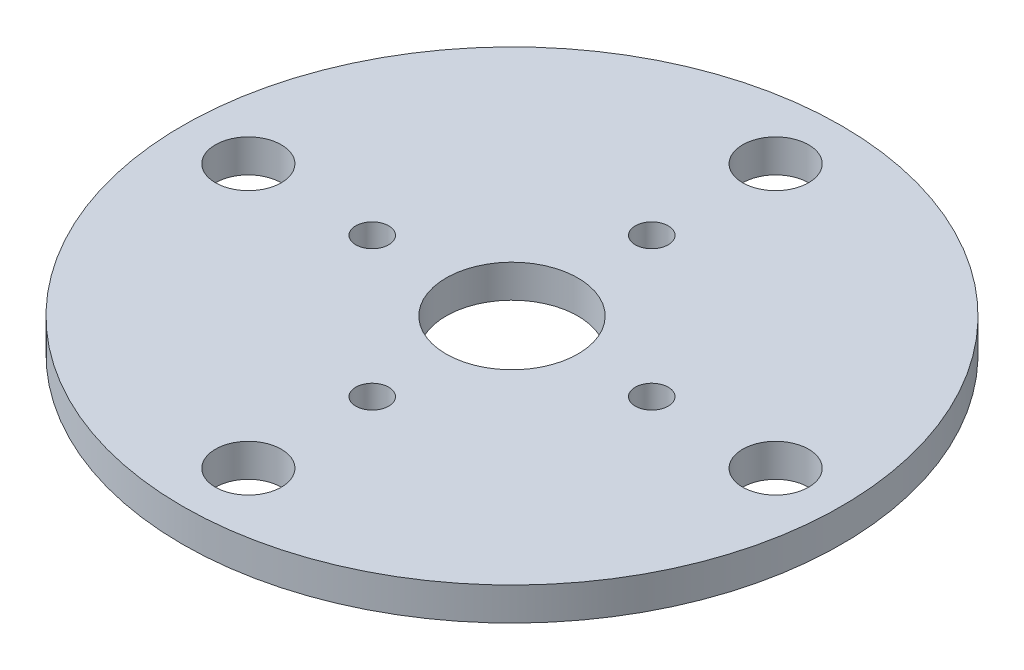
ISO-10303-21;
HEADER;
FILE_DESCRIPTION(('STEP AP214'),'2;1');
FILE_NAME('part.step','',(''),(''),'','','');
FILE_SCHEMA(('AUTOMOTIVE_DESIGN { 1 0 10303 214 1 1 1 1 }'));
ENDSEC;
DATA;
#1=APPLICATION_CONTEXT('core data for automotive mechanical design processes');
#2=APPLICATION_PROTOCOL_DEFINITION('international standard','automotive_design',2000,#1);
#3=PRODUCT_CONTEXT('',#1,'mechanical');
#4=PRODUCT('Part','Part','',(#3));
#5=PRODUCT_RELATED_PRODUCT_CATEGORY('part','',(#4));
#6=PRODUCT_DEFINITION_FORMATION('','',#4);
#7=PRODUCT_DEFINITION_CONTEXT('part definition',#1,'design');
#8=PRODUCT_DEFINITION('design','',#6,#7);
#9=PRODUCT_DEFINITION_SHAPE('','',#8);
#10=(LENGTH_UNIT() NAMED_UNIT(*) SI_UNIT(.MILLI.,.METRE.));
#11=(NAMED_UNIT(*) PLANE_ANGLE_UNIT() SI_UNIT($,.RADIAN.));
#12=(NAMED_UNIT(*) SI_UNIT($,.STERADIAN.) SOLID_ANGLE_UNIT());
#13=UNCERTAINTY_MEASURE_WITH_UNIT(LENGTH_MEASURE(1.E-05),#10,'distance_accuracy_value','');
#14=(GEOMETRIC_REPRESENTATION_CONTEXT(3) GLOBAL_UNCERTAINTY_ASSIGNED_CONTEXT((#13)) GLOBAL_UNIT_ASSIGNED_CONTEXT((#10,
#11,#12)) REPRESENTATION_CONTEXT('',''));
#15=CARTESIAN_POINT('',(0.,0.,0.));
#16=DIRECTION('',(0.,0.,1.));
#17=DIRECTION('',(1.,0.,0.));
#18=AXIS2_PLACEMENT_3D('',#15,#16,#17);
#19=CARTESIAN_POINT('',(0.,1.,0.));
#20=DIRECTION('',(0.,1.,0.));
#21=DIRECTION('',(0.,0.,1.));
#22=AXIS2_PLACEMENT_3D('',#19,#20,#21);
#23=PLANE('',#22);
#24=CARTESIAN_POINT('',(0.,1.,-4.24100258895612));
#25=DIRECTION('',(0.,1.,0.));
#26=DIRECTION('',(0.,0.,1.));
#27=AXIS2_PLACEMENT_3D('',#24,#25,#26);
#28=CIRCLE('',#27,0.499999999999999);
#29=CARTESIAN_POINT('',(0.,1.,-3.74100258895613));
#30=VERTEX_POINT('',#29);
#31=EDGE_CURVE('E83',#30,#30,#28,.T.);
#32=ORIENTED_EDGE('',*,*,#31,.F.);
#33=EDGE_LOOP('',(#32));
#34=FACE_BOUND('',#33,.T.);
#35=CARTESIAN_POINT('',(4.24100258895612,1.,0.));
#36=DIRECTION('',(0.,1.,0.));
#37=DIRECTION('',(0.,0.,-1.));
#38=AXIS2_PLACEMENT_3D('',#35,#36,#37);
#39=CIRCLE('',#38,0.5);
#40=CARTESIAN_POINT('',(4.24100258895612,1.,-0.5));
#41=VERTEX_POINT('',#40);
#42=EDGE_CURVE('E71',#41,#41,#39,.T.);
#43=ORIENTED_EDGE('',*,*,#42,.F.);
#44=EDGE_LOOP('',(#43));
#45=FACE_BOUND('',#44,.T.);
#46=CARTESIAN_POINT('',(0.,1.,4.24100258895612));
#47=DIRECTION('',(0.,1.,0.));
#48=DIRECTION('',(0.,0.,-1.));
#49=AXIS2_PLACEMENT_3D('',#46,#47,#48);
#50=CIRCLE('',#49,0.5);
#51=CARTESIAN_POINT('',(0.,1.,3.74100258895612));
#52=VERTEX_POINT('',#51);
#53=EDGE_CURVE('E59',#52,#52,#50,.T.);
#54=ORIENTED_EDGE('',*,*,#53,.F.);
#55=EDGE_LOOP('',(#54));
#56=FACE_BOUND('',#55,.T.);
#57=CARTESIAN_POINT('',(-8.,1.,0.));
#58=DIRECTION('',(0.,1.,0.));
#59=DIRECTION('',(0.,0.,1.));
#60=AXIS2_PLACEMENT_3D('',#57,#58,#59);
#61=CIRCLE('',#60,1.);
#62=CARTESIAN_POINT('',(-8.,1.,1.));
#63=VERTEX_POINT('',#62);
#64=EDGE_CURVE('E47',#63,#63,#61,.T.);
#65=ORIENTED_EDGE('',*,*,#64,.F.);
#66=EDGE_LOOP('',(#65));
#67=FACE_BOUND('',#66,.T.);
#68=CARTESIAN_POINT('',(0.,1.,0.));
#69=DIRECTION('',(0.,1.,0.));
#70=DIRECTION('',(0.,0.,1.));
#71=AXIS2_PLACEMENT_3D('',#68,#69,#70);
#72=CIRCLE('',#71,10.);
#73=CARTESIAN_POINT('',(0.,1.,10.));
#74=VERTEX_POINT('',#73);
#75=EDGE_CURVE('E10',#74,#74,#72,.T.);
#76=ORIENTED_EDGE('',*,*,#75,.T.);
#77=EDGE_LOOP('',(#76));
#78=FACE_BOUND('',#77,.T.);
#79=CARTESIAN_POINT('',(0.,1.,0.));
#80=DIRECTION('',(0.,1.,0.));
#81=DIRECTION('',(0.,0.,1.));
#82=AXIS2_PLACEMENT_3D('',#79,#80,#81);
#83=CIRCLE('',#82,2.);
#84=CARTESIAN_POINT('',(0.,1.,2.));
#85=VERTEX_POINT('',#84);
#86=EDGE_CURVE('E42',#85,#85,#83,.T.);
#87=ORIENTED_EDGE('',*,*,#86,.F.);
#88=EDGE_LOOP('',(#87));
#89=FACE_BOUND('',#88,.T.);
#90=CARTESIAN_POINT('',(-4.24100258895612,1.,0.));
#91=DIRECTION('',(0.,1.,0.));
#92=DIRECTION('',(0.,0.,1.));
#93=AXIS2_PLACEMENT_3D('',#90,#91,#92);
#94=CIRCLE('',#93,0.5);
#95=CARTESIAN_POINT('',(-4.24100258895612,1.,0.5));
#96=VERTEX_POINT('',#95);
#97=EDGE_CURVE('E53',#96,#96,#94,.T.);
#98=ORIENTED_EDGE('',*,*,#97,.F.);
#99=EDGE_LOOP('',(#98));
#100=FACE_BOUND('',#99,.T.);
#101=CARTESIAN_POINT('',(0.,1.,8.));
#102=DIRECTION('',(0.,1.,0.));
#103=DIRECTION('',(0.,0.,-1.));
#104=AXIS2_PLACEMENT_3D('',#101,#102,#103);
#105=CIRCLE('',#104,1.);
#106=CARTESIAN_POINT('',(0.,1.,7.));
#107=VERTEX_POINT('',#106);
#108=EDGE_CURVE('E65',#107,#107,#105,.T.);
#109=ORIENTED_EDGE('',*,*,#108,.F.);
#110=EDGE_LOOP('',(#109));
#111=FACE_BOUND('',#110,.T.);
#112=CARTESIAN_POINT('',(8.,1.,0.));
#113=DIRECTION('',(0.,1.,0.));
#114=DIRECTION('',(0.,0.,-1.));
#115=AXIS2_PLACEMENT_3D('',#112,#113,#114);
#116=CIRCLE('',#115,1.);
#117=CARTESIAN_POINT('',(8.,1.,-1.));
#118=VERTEX_POINT('',#117);
#119=EDGE_CURVE('E77',#118,#118,#116,.T.);
#120=ORIENTED_EDGE('',*,*,#119,.F.);
#121=EDGE_LOOP('',(#120));
#122=FACE_BOUND('',#121,.T.);
#123=CARTESIAN_POINT('',(0.,1.,-8.));
#124=DIRECTION('',(0.,1.,0.));
#125=DIRECTION('',(0.,0.,1.));
#126=AXIS2_PLACEMENT_3D('',#123,#124,#125);
#127=CIRCLE('',#126,1.);
#128=CARTESIAN_POINT('',(0.,1.,-7.));
#129=VERTEX_POINT('',#128);
#130=EDGE_CURVE('E89',#129,#129,#127,.T.);
#131=ORIENTED_EDGE('',*,*,#130,.F.);
#132=EDGE_LOOP('',(#131));
#133=FACE_BOUND('',#132,.T.);
#134=ADVANCED_FACE('F31',(#34,#45,#56,#67,#78,#89,#100,#111,#122,#133),#23,.T.);
#135=CARTESIAN_POINT('',(0.,0.,0.));
#136=DIRECTION('',(0.,1.,0.));
#137=DIRECTION('',(0.,0.,1.));
#138=AXIS2_PLACEMENT_3D('',#135,#136,#137);
#139=PLANE('',#138);
#140=CARTESIAN_POINT('',(0.,0.,0.));
#141=DIRECTION('',(0.,1.,0.));
#142=DIRECTION('',(0.,0.,1.));
#143=AXIS2_PLACEMENT_3D('',#140,#141,#142);
#144=CIRCLE('',#143,10.);
#145=CARTESIAN_POINT('',(0.,0.,10.));
#146=VERTEX_POINT('',#145);
#147=EDGE_CURVE('E35',#146,#146,#144,.T.);
#148=ORIENTED_EDGE('',*,*,#147,.F.);
#149=EDGE_LOOP('',(#148));
#150=FACE_BOUND('',#149,.T.);
#151=CARTESIAN_POINT('',(0.,0.,0.));
#152=DIRECTION('',(0.,1.,0.));
#153=DIRECTION('',(0.,0.,1.));
#154=AXIS2_PLACEMENT_3D('',#151,#152,#153);
#155=CIRCLE('',#154,2.);
#156=CARTESIAN_POINT('',(0.,0.,2.));
#157=VERTEX_POINT('',#156);
#158=EDGE_CURVE('E44',#157,#157,#155,.T.);
#159=ORIENTED_EDGE('',*,*,#158,.T.);
#160=EDGE_LOOP('',(#159));
#161=FACE_BOUND('',#160,.T.);
#162=CARTESIAN_POINT('',(-8.,0.,0.));
#163=DIRECTION('',(0.,1.,0.));
#164=DIRECTION('',(0.,0.,1.));
#165=AXIS2_PLACEMENT_3D('',#162,#163,#164);
#166=CIRCLE('',#165,1.);
#167=CARTESIAN_POINT('',(-8.,0.,1.));
#168=VERTEX_POINT('',#167);
#169=EDGE_CURVE('E50',#168,#168,#166,.T.);
#170=ORIENTED_EDGE('',*,*,#169,.T.);
#171=EDGE_LOOP('',(#170));
#172=FACE_BOUND('',#171,.T.);
#173=CARTESIAN_POINT('',(-4.24100258895612,0.,0.));
#174=DIRECTION('',(0.,1.,0.));
#175=DIRECTION('',(0.,0.,1.));
#176=AXIS2_PLACEMENT_3D('',#173,#174,#175);
#177=CIRCLE('',#176,0.5);
#178=CARTESIAN_POINT('',(-4.24100258895612,0.,0.5));
#179=VERTEX_POINT('',#178);
#180=EDGE_CURVE('E56',#179,#179,#177,.T.);
#181=ORIENTED_EDGE('',*,*,#180,.T.);
#182=EDGE_LOOP('',(#181));
#183=FACE_BOUND('',#182,.T.);
#184=CARTESIAN_POINT('',(0.,0.,4.24100258895612));
#185=DIRECTION('',(0.,1.,0.));
#186=DIRECTION('',(0.,0.,-1.));
#187=AXIS2_PLACEMENT_3D('',#184,#185,#186);
#188=CIRCLE('',#187,0.5);
#189=CARTESIAN_POINT('',(0.,0.,3.74100258895612));
#190=VERTEX_POINT('',#189);
#191=EDGE_CURVE('E62',#190,#190,#188,.T.);
#192=ORIENTED_EDGE('',*,*,#191,.T.);
#193=EDGE_LOOP('',(#192));
#194=FACE_BOUND('',#193,.T.);
#195=CARTESIAN_POINT('',(0.,0.,8.));
#196=DIRECTION('',(0.,1.,0.));
#197=DIRECTION('',(0.,0.,-1.));
#198=AXIS2_PLACEMENT_3D('',#195,#196,#197);
#199=CIRCLE('',#198,1.);
#200=CARTESIAN_POINT('',(0.,0.,7.));
#201=VERTEX_POINT('',#200);
#202=EDGE_CURVE('E68',#201,#201,#199,.T.);
#203=ORIENTED_EDGE('',*,*,#202,.T.);
#204=EDGE_LOOP('',(#203));
#205=FACE_BOUND('',#204,.T.);
#206=CARTESIAN_POINT('',(4.24100258895612,0.,0.));
#207=DIRECTION('',(0.,1.,0.));
#208=DIRECTION('',(0.,0.,-1.));
#209=AXIS2_PLACEMENT_3D('',#206,#207,#208);
#210=CIRCLE('',#209,0.5);
#211=CARTESIAN_POINT('',(4.24100258895612,0.,-0.5));
#212=VERTEX_POINT('',#211);
#213=EDGE_CURVE('E74',#212,#212,#210,.T.);
#214=ORIENTED_EDGE('',*,*,#213,.T.);
#215=EDGE_LOOP('',(#214));
#216=FACE_BOUND('',#215,.T.);
#217=CARTESIAN_POINT('',(8.,0.,0.));
#218=DIRECTION('',(0.,1.,0.));
#219=DIRECTION('',(0.,0.,-1.));
#220=AXIS2_PLACEMENT_3D('',#217,#218,#219);
#221=CIRCLE('',#220,1.);
#222=CARTESIAN_POINT('',(8.,0.,-1.));
#223=VERTEX_POINT('',#222);
#224=EDGE_CURVE('E80',#223,#223,#221,.T.);
#225=ORIENTED_EDGE('',*,*,#224,.T.);
#226=EDGE_LOOP('',(#225));
#227=FACE_BOUND('',#226,.T.);
#228=CARTESIAN_POINT('',(0.,0.,-4.24100258895612));
#229=DIRECTION('',(0.,1.,0.));
#230=DIRECTION('',(0.,0.,1.));
#231=AXIS2_PLACEMENT_3D('',#228,#229,#230);
#232=CIRCLE('',#231,0.499999999999999);
#233=CARTESIAN_POINT('',(0.,0.,-3.74100258895613));
#234=VERTEX_POINT('',#233);
#235=EDGE_CURVE('E86',#234,#234,#232,.T.);
#236=ORIENTED_EDGE('',*,*,#235,.T.);
#237=EDGE_LOOP('',(#236));
#238=FACE_BOUND('',#237,.T.);
#239=CARTESIAN_POINT('',(0.,0.,-8.));
#240=DIRECTION('',(0.,1.,0.));
#241=DIRECTION('',(0.,0.,1.));
#242=AXIS2_PLACEMENT_3D('',#239,#240,#241);
#243=CIRCLE('',#242,1.);
#244=CARTESIAN_POINT('',(0.,0.,-7.));
#245=VERTEX_POINT('',#244);
#246=EDGE_CURVE('E92',#245,#245,#243,.T.);
#247=ORIENTED_EDGE('',*,*,#246,.T.);
#248=EDGE_LOOP('',(#247));
#249=FACE_BOUND('',#248,.T.);
#250=ADVANCED_FACE('F102',(#150,#161,#172,#183,#194,#205,#216,#227,#238,#249),#139,.F.);
#251=CARTESIAN_POINT('',(0.,1.,0.));
#252=DIRECTION('',(0.,-1.,0.));
#253=DIRECTION('',(0.,0.,-1.));
#254=AXIS2_PLACEMENT_3D('',#251,#252,#253);
#255=CYLINDRICAL_SURFACE('',#254,10.);
#256=ORIENTED_EDGE('',*,*,#75,.F.);
#257=EDGE_LOOP('',(#256));
#258=FACE_BOUND('',#257,.T.);
#259=ORIENTED_EDGE('',*,*,#147,.T.);
#260=EDGE_LOOP('',(#259));
#261=FACE_BOUND('',#260,.T.);
#262=ADVANCED_FACE('F33',(#258,#261),#255,.T.);
#263=CARTESIAN_POINT('',(0.,1.,0.));
#264=DIRECTION('',(0.,-1.,0.));
#265=DIRECTION('',(0.,0.,-1.));
#266=AXIS2_PLACEMENT_3D('',#263,#264,#265);
#267=CYLINDRICAL_SURFACE('',#266,2.);
#268=ORIENTED_EDGE('',*,*,#86,.T.);
#269=EDGE_LOOP('',(#268));
#270=FACE_BOUND('',#269,.T.);
#271=ORIENTED_EDGE('',*,*,#158,.F.);
#272=EDGE_LOOP('',(#271));
#273=FACE_BOUND('',#272,.T.);
#274=ADVANCED_FACE('F112',(#270,#273),#267,.F.);
#275=CARTESIAN_POINT('',(-8.,1.,0.));
#276=DIRECTION('',(0.,-1.,0.));
#277=DIRECTION('',(0.,0.,-1.));
#278=AXIS2_PLACEMENT_3D('',#275,#276,#277);
#279=CYLINDRICAL_SURFACE('',#278,1.);
#280=ORIENTED_EDGE('',*,*,#64,.T.);
#281=EDGE_LOOP('',(#280));
#282=FACE_BOUND('',#281,.T.);
#283=ORIENTED_EDGE('',*,*,#169,.F.);
#284=EDGE_LOOP('',(#283));
#285=FACE_BOUND('',#284,.T.);
#286=ADVANCED_FACE('F115',(#282,#285),#279,.F.);
#287=CARTESIAN_POINT('',(-4.24100258895612,1.,0.));
#288=DIRECTION('',(0.,-1.,0.));
#289=DIRECTION('',(0.,0.,-1.));
#290=AXIS2_PLACEMENT_3D('',#287,#288,#289);
#291=CYLINDRICAL_SURFACE('',#290,0.5);
#292=ORIENTED_EDGE('',*,*,#97,.T.);
#293=EDGE_LOOP('',(#292));
#294=FACE_BOUND('',#293,.T.);
#295=ORIENTED_EDGE('',*,*,#180,.F.);
#296=EDGE_LOOP('',(#295));
#297=FACE_BOUND('',#296,.T.);
#298=ADVANCED_FACE('F119',(#294,#297),#291,.F.);
#299=CARTESIAN_POINT('',(0.,1.,4.24100258895612));
#300=DIRECTION('',(0.,-1.,0.));
#301=DIRECTION('',(0.,0.,-1.));
#302=AXIS2_PLACEMENT_3D('',#299,#300,#301);
#303=CYLINDRICAL_SURFACE('',#302,0.5);
#304=ORIENTED_EDGE('',*,*,#53,.T.);
#305=EDGE_LOOP('',(#304));
#306=FACE_BOUND('',#305,.T.);
#307=ORIENTED_EDGE('',*,*,#191,.F.);
#308=EDGE_LOOP('',(#307));
#309=FACE_BOUND('',#308,.T.);
#310=ADVANCED_FACE('F123',(#306,#309),#303,.F.);
#311=CARTESIAN_POINT('',(0.,1.,8.));
#312=DIRECTION('',(0.,-1.,0.));
#313=DIRECTION('',(0.,0.,-1.));
#314=AXIS2_PLACEMENT_3D('',#311,#312,#313);
#315=CYLINDRICAL_SURFACE('',#314,1.);
#316=ORIENTED_EDGE('',*,*,#108,.T.);
#317=EDGE_LOOP('',(#316));
#318=FACE_BOUND('',#317,.T.);
#319=ORIENTED_EDGE('',*,*,#202,.F.);
#320=EDGE_LOOP('',(#319));
#321=FACE_BOUND('',#320,.T.);
#322=ADVANCED_FACE('F127',(#318,#321),#315,.F.);
#323=CARTESIAN_POINT('',(4.24100258895612,1.,0.));
#324=DIRECTION('',(0.,-1.,0.));
#325=DIRECTION('',(0.,0.,-1.));
#326=AXIS2_PLACEMENT_3D('',#323,#324,#325);
#327=CYLINDRICAL_SURFACE('',#326,0.5);
#328=ORIENTED_EDGE('',*,*,#42,.T.);
#329=EDGE_LOOP('',(#328));
#330=FACE_BOUND('',#329,.T.);
#331=ORIENTED_EDGE('',*,*,#213,.F.);
#332=EDGE_LOOP('',(#331));
#333=FACE_BOUND('',#332,.T.);
#334=ADVANCED_FACE('F131',(#330,#333),#327,.F.);
#335=CARTESIAN_POINT('',(8.,1.,0.));
#336=DIRECTION('',(0.,-1.,0.));
#337=DIRECTION('',(0.,0.,-1.));
#338=AXIS2_PLACEMENT_3D('',#335,#336,#337);
#339=CYLINDRICAL_SURFACE('',#338,1.);
#340=ORIENTED_EDGE('',*,*,#119,.T.);
#341=EDGE_LOOP('',(#340));
#342=FACE_BOUND('',#341,.T.);
#343=ORIENTED_EDGE('',*,*,#224,.F.);
#344=EDGE_LOOP('',(#343));
#345=FACE_BOUND('',#344,.T.);
#346=ADVANCED_FACE('F135',(#342,#345),#339,.F.);
#347=CARTESIAN_POINT('',(0.,1.,-4.24100258895612));
#348=DIRECTION('',(0.,-1.,0.));
#349=DIRECTION('',(0.,0.,-1.));
#350=AXIS2_PLACEMENT_3D('',#347,#348,#349);
#351=CYLINDRICAL_SURFACE('',#350,0.499999999999999);
#352=ORIENTED_EDGE('',*,*,#31,.T.);
#353=EDGE_LOOP('',(#352));
#354=FACE_BOUND('',#353,.T.);
#355=ORIENTED_EDGE('',*,*,#235,.F.);
#356=EDGE_LOOP('',(#355));
#357=FACE_BOUND('',#356,.T.);
#358=ADVANCED_FACE('F139',(#354,#357),#351,.F.);
#359=CARTESIAN_POINT('',(0.,1.,-8.));
#360=DIRECTION('',(0.,-1.,0.));
#361=DIRECTION('',(0.,0.,-1.));
#362=AXIS2_PLACEMENT_3D('',#359,#360,#361);
#363=CYLINDRICAL_SURFACE('',#362,1.);
#364=ORIENTED_EDGE('',*,*,#130,.T.);
#365=EDGE_LOOP('',(#364));
#366=FACE_BOUND('',#365,.T.);
#367=ORIENTED_EDGE('',*,*,#246,.F.);
#368=EDGE_LOOP('',(#367));
#369=FACE_BOUND('',#368,.T.);
#370=ADVANCED_FACE('F98',(#366,#369),#363,.F.);
#371=CLOSED_SHELL('',(#134,#250,#262,#274,#286,#298,#310,#322,#334,#346,#358,#370));
#372=MANIFOLD_SOLID_BREP('B2',#371);
#373=ADVANCED_BREP_SHAPE_REPRESENTATION('',(#18,#372),#14);
#374=SHAPE_DEFINITION_REPRESENTATION(#9,#373);
ENDSEC;
END-ISO-10303-21;
